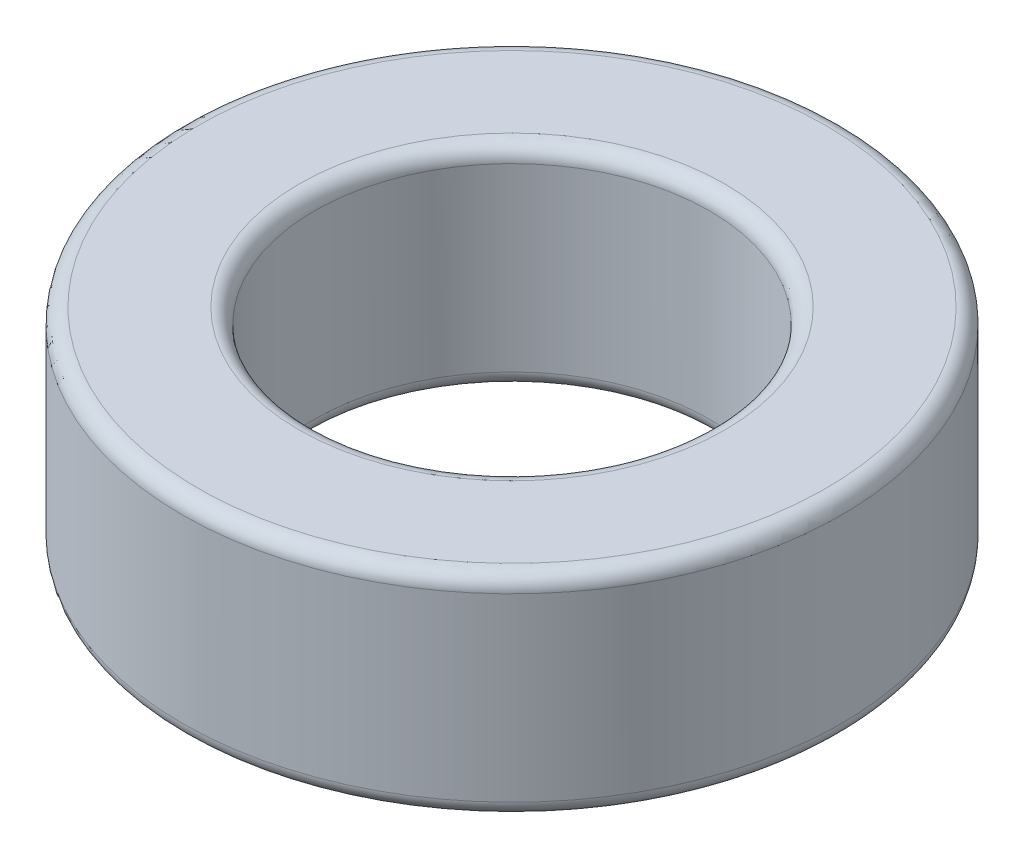
ISO-10303-21;
HEADER;
FILE_DESCRIPTION(('STEP AP214'),'2;1');
FILE_NAME('part.step','',(''),(''),'','','');
FILE_SCHEMA(('AUTOMOTIVE_DESIGN { 1 0 10303 214 1 1 1 1 }'));
ENDSEC;
DATA;
#1=APPLICATION_CONTEXT('core data for automotive mechanical design processes');
#2=APPLICATION_PROTOCOL_DEFINITION('international standard','automotive_design',2000,#1);
#3=PRODUCT_CONTEXT('',#1,'mechanical');
#4=PRODUCT('Part','Part','',(#3));
#5=PRODUCT_RELATED_PRODUCT_CATEGORY('part','',(#4));
#6=PRODUCT_DEFINITION_FORMATION('','',#4);
#7=PRODUCT_DEFINITION_CONTEXT('part definition',#1,'design');
#8=PRODUCT_DEFINITION('design','',#6,#7);
#9=PRODUCT_DEFINITION_SHAPE('','',#8);
#10=(LENGTH_UNIT() NAMED_UNIT(*) SI_UNIT(.MILLI.,.METRE.));
#11=(NAMED_UNIT(*) PLANE_ANGLE_UNIT() SI_UNIT($,.RADIAN.));
#12=(NAMED_UNIT(*) SI_UNIT($,.STERADIAN.) SOLID_ANGLE_UNIT());
#13=UNCERTAINTY_MEASURE_WITH_UNIT(LENGTH_MEASURE(1.E-05),#10,'distance_accuracy_value','');
#14=(GEOMETRIC_REPRESENTATION_CONTEXT(3) GLOBAL_UNCERTAINTY_ASSIGNED_CONTEXT((#13)) GLOBAL_UNIT_ASSIGNED_CONTEXT((#10,
#11,#12)) REPRESENTATION_CONTEXT('',''));
#15=CARTESIAN_POINT('',(0.,0.,0.));
#16=DIRECTION('',(0.,0.,1.));
#17=DIRECTION('',(1.,0.,0.));
#18=AXIS2_PLACEMENT_3D('',#15,#16,#17);
#19=CARTESIAN_POINT('',(0.,15.8865814696486,0.));
#20=DIRECTION('',(0.,1.,0.));
#21=DIRECTION('',(0.,0.,1.));
#22=AXIS2_PLACEMENT_3D('',#19,#20,#21);
#23=CYLINDRICAL_SURFACE('',#22,21.275);
#24=CARTESIAN_POINT('',(0.,-5.825,0.));
#25=DIRECTION('',(0.,1.,0.));
#26=DIRECTION('',(0.,0.,1.));
#27=AXIS2_PLACEMENT_3D('',#24,#25,#26);
#28=CIRCLE('',#27,21.275);
#29=CARTESIAN_POINT('',(0.,-5.825,21.275));
#30=VERTEX_POINT('',#29);
#31=EDGE_CURVE('E43',#30,#30,#28,.T.);
#32=ORIENTED_EDGE('',*,*,#31,.T.);
#33=EDGE_LOOP('',(#32));
#34=FACE_BOUND('',#33,.T.);
#35=CARTESIAN_POINT('',(0.,5.825,0.));
#36=DIRECTION('',(0.,-1.,0.));
#37=DIRECTION('',(0.,0.,-1.));
#38=AXIS2_PLACEMENT_3D('',#35,#36,#37);
#39=CIRCLE('',#38,21.275);
#40=CARTESIAN_POINT('',(0.,5.825,-21.275));
#41=VERTEX_POINT('',#40);
#42=EDGE_CURVE('E47',#41,#41,#39,.T.);
#43=ORIENTED_EDGE('',*,*,#42,.T.);
#44=EDGE_LOOP('',(#43));
#45=FACE_BOUND('',#44,.T.);
#46=ADVANCED_FACE('F32',(#34,#45),#23,.T.);
#47=CARTESIAN_POINT('',(12.75,6.825,0.));
#48=DIRECTION('',(0.,-1.,0.));
#49=DIRECTION('',(0.,0.,-1.));
#50=AXIS2_PLACEMENT_3D('',#47,#48,#49);
#51=PLANE('',#50);
#52=CARTESIAN_POINT('',(0.,6.825,0.));
#53=DIRECTION('',(0.,-1.,0.));
#54=DIRECTION('',(0.,0.,-1.));
#55=AXIS2_PLACEMENT_3D('',#52,#53,#54);
#56=CIRCLE('',#55,20.275);
#57=CARTESIAN_POINT('',(0.,6.825,-20.275));
#58=VERTEX_POINT('',#57);
#59=EDGE_CURVE('E10',#58,#58,#56,.F.);
#60=ORIENTED_EDGE('',*,*,#59,.T.);
#61=EDGE_LOOP('',(#60));
#62=FACE_BOUND('',#61,.T.);
#63=CARTESIAN_POINT('',(0.,6.825,0.));
#64=DIRECTION('',(0.,-1.,0.));
#65=DIRECTION('',(0.,0.,-1.));
#66=AXIS2_PLACEMENT_3D('',#63,#64,#65);
#67=CIRCLE('',#66,13.75);
#68=CARTESIAN_POINT('',(0.,6.825,-13.75));
#69=VERTEX_POINT('',#68);
#70=EDGE_CURVE('E39',#69,#69,#67,.T.);
#71=ORIENTED_EDGE('',*,*,#70,.T.);
#72=EDGE_LOOP('',(#71));
#73=FACE_BOUND('',#72,.T.);
#74=ADVANCED_FACE('F77',(#62,#73),#51,.F.);
#75=CARTESIAN_POINT('',(0.,15.8865814696486,0.));
#76=DIRECTION('',(0.,1.,0.));
#77=DIRECTION('',(0.,0.,1.));
#78=AXIS2_PLACEMENT_3D('',#75,#76,#77);
#79=CYLINDRICAL_SURFACE('',#78,12.75);
#80=CARTESIAN_POINT('',(0.,-5.825,0.));
#81=DIRECTION('',(0.,1.,0.));
#82=DIRECTION('',(0.,0.,1.));
#83=AXIS2_PLACEMENT_3D('',#80,#81,#82);
#84=CIRCLE('',#83,12.75);
#85=CARTESIAN_POINT('',(0.,-5.825,12.75));
#86=VERTEX_POINT('',#85);
#87=EDGE_CURVE('E52',#86,#86,#84,.F.);
#88=ORIENTED_EDGE('',*,*,#87,.T.);
#89=EDGE_LOOP('',(#88));
#90=FACE_BOUND('',#89,.T.);
#91=CARTESIAN_POINT('',(0.,5.825,0.));
#92=DIRECTION('',(0.,-1.,0.));
#93=DIRECTION('',(0.,0.,-1.));
#94=AXIS2_PLACEMENT_3D('',#91,#92,#93);
#95=CIRCLE('',#94,12.75);
#96=CARTESIAN_POINT('',(0.,5.825,-12.75));
#97=VERTEX_POINT('',#96);
#98=EDGE_CURVE('E55',#97,#97,#95,.F.);
#99=ORIENTED_EDGE('',*,*,#98,.T.);
#100=EDGE_LOOP('',(#99));
#101=FACE_BOUND('',#100,.T.);
#102=ADVANCED_FACE('F93',(#90,#101),#79,.F.);
#103=CARTESIAN_POINT('',(12.75,-6.825,0.));
#104=DIRECTION('',(0.,1.,0.));
#105=DIRECTION('',(0.,0.,1.));
#106=AXIS2_PLACEMENT_3D('',#103,#104,#105);
#107=PLANE('',#106);
#108=CARTESIAN_POINT('',(0.,-6.825,0.));
#109=DIRECTION('',(0.,1.,0.));
#110=DIRECTION('',(0.,0.,1.));
#111=AXIS2_PLACEMENT_3D('',#108,#109,#110);
#112=CIRCLE('',#111,13.75);
#113=CARTESIAN_POINT('',(0.,-6.825,13.75));
#114=VERTEX_POINT('',#113);
#115=EDGE_CURVE('E58',#114,#114,#112,.T.);
#116=ORIENTED_EDGE('',*,*,#115,.T.);
#117=EDGE_LOOP('',(#116));
#118=FACE_BOUND('',#117,.T.);
#119=CARTESIAN_POINT('',(0.,-6.825,0.));
#120=DIRECTION('',(0.,1.,0.));
#121=DIRECTION('',(0.,0.,1.));
#122=AXIS2_PLACEMENT_3D('',#119,#120,#121);
#123=CIRCLE('',#122,20.275);
#124=CARTESIAN_POINT('',(0.,-6.825,20.275));
#125=VERTEX_POINT('',#124);
#126=EDGE_CURVE('E61',#125,#125,#123,.F.);
#127=ORIENTED_EDGE('',*,*,#126,.T.);
#128=EDGE_LOOP('',(#127));
#129=FACE_BOUND('',#128,.T.);
#130=ADVANCED_FACE('F65',(#118,#129),#107,.F.);
#131=CARTESIAN_POINT('',(0.,-5.825,0.));
#132=DIRECTION('',(0.,1.,0.));
#133=DIRECTION('',(0.,0.,1.));
#134=AXIS2_PLACEMENT_3D('',#131,#132,#133);
#135=TOROIDAL_SURFACE('',#134,13.75,1.);
#136=ORIENTED_EDGE('',*,*,#87,.F.);
#137=EDGE_LOOP('',(#136));
#138=FACE_BOUND('',#137,.T.);
#139=ORIENTED_EDGE('',*,*,#115,.F.);
#140=EDGE_LOOP('',(#139));
#141=FACE_BOUND('',#140,.T.);
#142=ADVANCED_FACE('F71',(#138,#141),#135,.T.);
#143=CARTESIAN_POINT('',(0.,-5.825,0.));
#144=DIRECTION('',(0.,1.,0.));
#145=DIRECTION('',(0.,0.,1.));
#146=AXIS2_PLACEMENT_3D('',#143,#144,#145);
#147=TOROIDAL_SURFACE('',#146,20.275,1.);
#148=ORIENTED_EDGE('',*,*,#126,.F.);
#149=EDGE_LOOP('',(#148));
#150=FACE_BOUND('',#149,.T.);
#151=ORIENTED_EDGE('',*,*,#31,.F.);
#152=EDGE_LOOP('',(#151));
#153=FACE_BOUND('',#152,.T.);
#154=ADVANCED_FACE('F67',(#150,#153),#147,.T.);
#155=CARTESIAN_POINT('',(0.,5.825,0.));
#156=DIRECTION('',(0.,-1.,0.));
#157=DIRECTION('',(0.,0.,-1.));
#158=AXIS2_PLACEMENT_3D('',#155,#156,#157);
#159=TOROIDAL_SURFACE('',#158,20.275,1.);
#160=ORIENTED_EDGE('',*,*,#42,.F.);
#161=EDGE_LOOP('',(#160));
#162=FACE_BOUND('',#161,.T.);
#163=ORIENTED_EDGE('',*,*,#59,.F.);
#164=EDGE_LOOP('',(#163));
#165=FACE_BOUND('',#164,.T.);
#166=ADVANCED_FACE('F70',(#162,#165),#159,.T.);
#167=CARTESIAN_POINT('',(0.,5.825,0.));
#168=DIRECTION('',(0.,-1.,0.));
#169=DIRECTION('',(0.,0.,-1.));
#170=AXIS2_PLACEMENT_3D('',#167,#168,#169);
#171=TOROIDAL_SURFACE('',#170,13.75,1.);
#172=ORIENTED_EDGE('',*,*,#70,.F.);
#173=EDGE_LOOP('',(#172));
#174=FACE_BOUND('',#173,.T.);
#175=ORIENTED_EDGE('',*,*,#98,.F.);
#176=EDGE_LOOP('',(#175));
#177=FACE_BOUND('',#176,.T.);
#178=ADVANCED_FACE('F34',(#174,#177),#171,.T.);
#179=CLOSED_SHELL('',(#46,#74,#102,#130,#142,#154,#166,#178));
#180=MANIFOLD_SOLID_BREP('B2',#179);
#181=ADVANCED_BREP_SHAPE_REPRESENTATION('',(#18,#180),#14);
#182=SHAPE_DEFINITION_REPRESENTATION(#9,#181);
ENDSEC;
END-ISO-10303-21;
